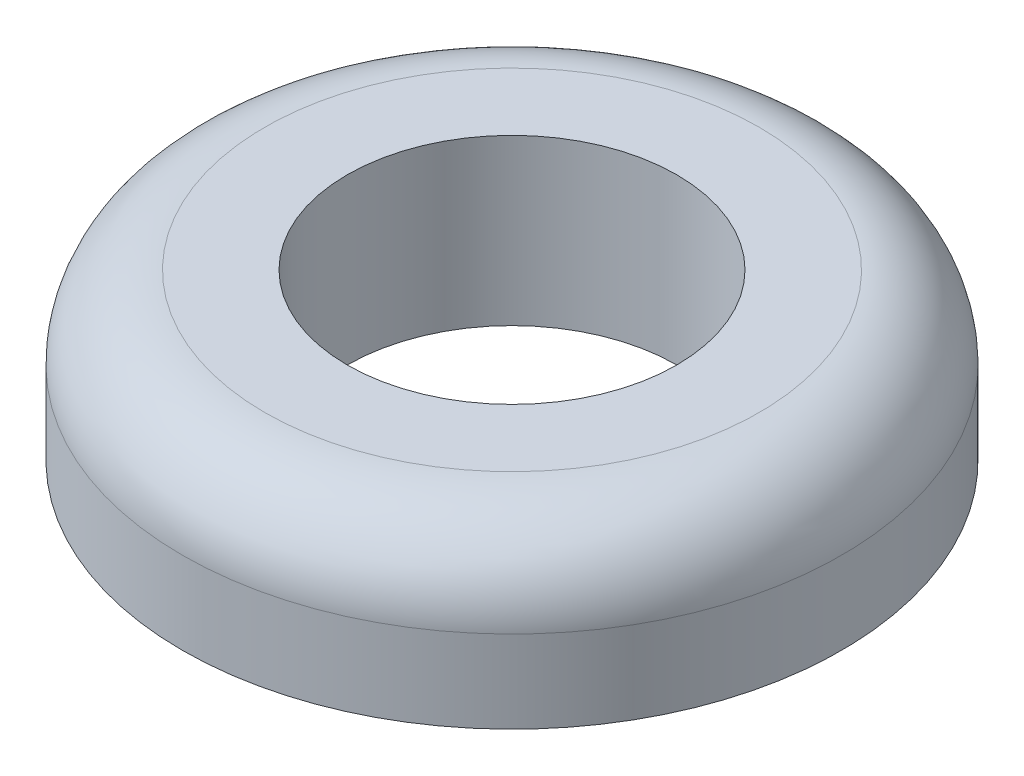
ISO-10303-21;
HEADER;
FILE_DESCRIPTION(('STEP AP214'),'2;1');
FILE_NAME('part.step','',(''),(''),'','','');
FILE_SCHEMA(('AUTOMOTIVE_DESIGN { 1 0 10303 214 1 1 1 1 }'));
ENDSEC;
DATA;
#1=APPLICATION_CONTEXT('core data for automotive mechanical design processes');
#2=APPLICATION_PROTOCOL_DEFINITION('international standard','automotive_design',2000,#1);
#3=PRODUCT_CONTEXT('',#1,'mechanical');
#4=PRODUCT('Part','Part','',(#3));
#5=PRODUCT_RELATED_PRODUCT_CATEGORY('part','',(#4));
#6=PRODUCT_DEFINITION_FORMATION('','',#4);
#7=PRODUCT_DEFINITION_CONTEXT('part definition',#1,'design');
#8=PRODUCT_DEFINITION('design','',#6,#7);
#9=PRODUCT_DEFINITION_SHAPE('','',#8);
#10=(LENGTH_UNIT() NAMED_UNIT(*) SI_UNIT(.MILLI.,.METRE.));
#11=(NAMED_UNIT(*) PLANE_ANGLE_UNIT() SI_UNIT($,.RADIAN.));
#12=(NAMED_UNIT(*) SI_UNIT($,.STERADIAN.) SOLID_ANGLE_UNIT());
#13=UNCERTAINTY_MEASURE_WITH_UNIT(LENGTH_MEASURE(1.E-05),#10,'distance_accuracy_value','');
#14=(GEOMETRIC_REPRESENTATION_CONTEXT(3) GLOBAL_UNCERTAINTY_ASSIGNED_CONTEXT((#13)) GLOBAL_UNIT_ASSIGNED_CONTEXT((#10,
#11,#12)) REPRESENTATION_CONTEXT('',''));
#15=CARTESIAN_POINT('',(0.,0.,0.));
#16=DIRECTION('',(0.,0.,1.));
#17=DIRECTION('',(1.,0.,0.));
#18=AXIS2_PLACEMENT_3D('',#15,#16,#17);
#19=CARTESIAN_POINT('',(0.,3.175,0.));
#20=DIRECTION('',(0.,1.,0.));
#21=DIRECTION('',(0.,0.,1.));
#22=AXIS2_PLACEMENT_3D('',#19,#20,#21);
#23=PLANE('',#22);
#24=CARTESIAN_POINT('',(0.,3.175,0.));
#25=DIRECTION('',(0.,1.,0.));
#26=DIRECTION('',(0.,0.,1.));
#27=AXIS2_PLACEMENT_3D('',#24,#25,#26);
#28=CIRCLE('',#27,4.7625);
#29=CARTESIAN_POINT('',(0.,3.175,4.7625));
#30=VERTEX_POINT('',#29);
#31=EDGE_CURVE('E38',#30,#30,#28,.T.);
#32=ORIENTED_EDGE('',*,*,#31,.T.);
#33=EDGE_LOOP('',(#32));
#34=FACE_BOUND('',#33,.T.);
#35=CARTESIAN_POINT('',(0.,3.175,0.));
#36=DIRECTION('',(0.,1.,0.));
#37=DIRECTION('',(0.,0.,1.));
#38=AXIS2_PLACEMENT_3D('',#35,#36,#37);
#39=CIRCLE('',#38,3.175);
#40=CARTESIAN_POINT('',(0.,3.175,3.175));
#41=VERTEX_POINT('',#40);
#42=EDGE_CURVE('E46',#41,#41,#39,.T.);
#43=ORIENTED_EDGE('',*,*,#42,.F.);
#44=EDGE_LOOP('',(#43));
#45=FACE_BOUND('',#44,.T.);
#46=ADVANCED_FACE('F31',(#34,#45),#23,.T.);
#47=CARTESIAN_POINT('',(0.,0.,0.));
#48=DIRECTION('',(0.,1.,0.));
#49=DIRECTION('',(0.,0.,1.));
#50=AXIS2_PLACEMENT_3D('',#47,#48,#49);
#51=PLANE('',#50);
#52=CARTESIAN_POINT('',(0.,0.,0.));
#53=DIRECTION('',(0.,1.,0.));
#54=DIRECTION('',(0.,0.,1.));
#55=AXIS2_PLACEMENT_3D('',#52,#53,#54);
#56=CIRCLE('',#55,6.35);
#57=CARTESIAN_POINT('',(0.,0.,6.35));
#58=VERTEX_POINT('',#57);
#59=EDGE_CURVE('E42',#58,#58,#56,.T.);
#60=ORIENTED_EDGE('',*,*,#59,.F.);
#61=EDGE_LOOP('',(#60));
#62=FACE_BOUND('',#61,.T.);
#63=CARTESIAN_POINT('',(0.,0.,0.));
#64=DIRECTION('',(0.,1.,0.));
#65=DIRECTION('',(0.,0.,1.));
#66=AXIS2_PLACEMENT_3D('',#63,#64,#65);
#67=CIRCLE('',#66,3.175);
#68=CARTESIAN_POINT('',(0.,0.,3.175));
#69=VERTEX_POINT('',#68);
#70=EDGE_CURVE('E49',#69,#69,#67,.T.);
#71=ORIENTED_EDGE('',*,*,#70,.T.);
#72=EDGE_LOOP('',(#71));
#73=FACE_BOUND('',#72,.T.);
#74=ADVANCED_FACE('F59',(#62,#73),#51,.F.);
#75=CARTESIAN_POINT('',(0.,3.175,0.));
#76=DIRECTION('',(0.,-1.,0.));
#77=DIRECTION('',(0.,0.,-1.));
#78=AXIS2_PLACEMENT_3D('',#75,#76,#77);
#79=CYLINDRICAL_SURFACE('',#78,6.35);
#80=CARTESIAN_POINT('',(0.,1.5875,0.));
#81=DIRECTION('',(0.,1.,0.));
#82=DIRECTION('',(0.,0.,1.));
#83=AXIS2_PLACEMENT_3D('',#80,#81,#82);
#84=CIRCLE('',#83,6.35);
#85=CARTESIAN_POINT('',(0.,1.5875,6.35));
#86=VERTEX_POINT('',#85);
#87=EDGE_CURVE('E10',#86,#86,#84,.F.);
#88=ORIENTED_EDGE('',*,*,#87,.T.);
#89=EDGE_LOOP('',(#88));
#90=FACE_BOUND('',#89,.T.);
#91=ORIENTED_EDGE('',*,*,#59,.T.);
#92=EDGE_LOOP('',(#91));
#93=FACE_BOUND('',#92,.T.);
#94=ADVANCED_FACE('F64',(#90,#93),#79,.T.);
#95=CARTESIAN_POINT('',(0.,3.175,0.));
#96=DIRECTION('',(0.,-1.,0.));
#97=DIRECTION('',(0.,0.,-1.));
#98=AXIS2_PLACEMENT_3D('',#95,#96,#97);
#99=CYLINDRICAL_SURFACE('',#98,3.175);
#100=ORIENTED_EDGE('',*,*,#42,.T.);
#101=EDGE_LOOP('',(#100));
#102=FACE_BOUND('',#101,.T.);
#103=ORIENTED_EDGE('',*,*,#70,.F.);
#104=EDGE_LOOP('',(#103));
#105=FACE_BOUND('',#104,.T.);
#106=ADVANCED_FACE('F55',(#102,#105),#99,.F.);
#107=CARTESIAN_POINT('',(0.,1.5875,0.));
#108=DIRECTION('',(0.,1.,0.));
#109=DIRECTION('',(0.,0.,1.));
#110=AXIS2_PLACEMENT_3D('',#107,#108,#109);
#111=TOROIDAL_SURFACE('',#110,4.7625,1.5875);
#112=ORIENTED_EDGE('',*,*,#87,.F.);
#113=EDGE_LOOP('',(#112));
#114=FACE_BOUND('',#113,.T.);
#115=ORIENTED_EDGE('',*,*,#31,.F.);
#116=EDGE_LOOP('',(#115));
#117=FACE_BOUND('',#116,.T.);
#118=ADVANCED_FACE('F33',(#114,#117),#111,.T.);
#119=CLOSED_SHELL('',(#46,#74,#94,#106,#118));
#120=MANIFOLD_SOLID_BREP('B2',#119);
#121=ADVANCED_BREP_SHAPE_REPRESENTATION('',(#18,#120),#14);
#122=SHAPE_DEFINITION_REPRESENTATION(#9,#121);
ENDSEC;
END-ISO-10303-21;
